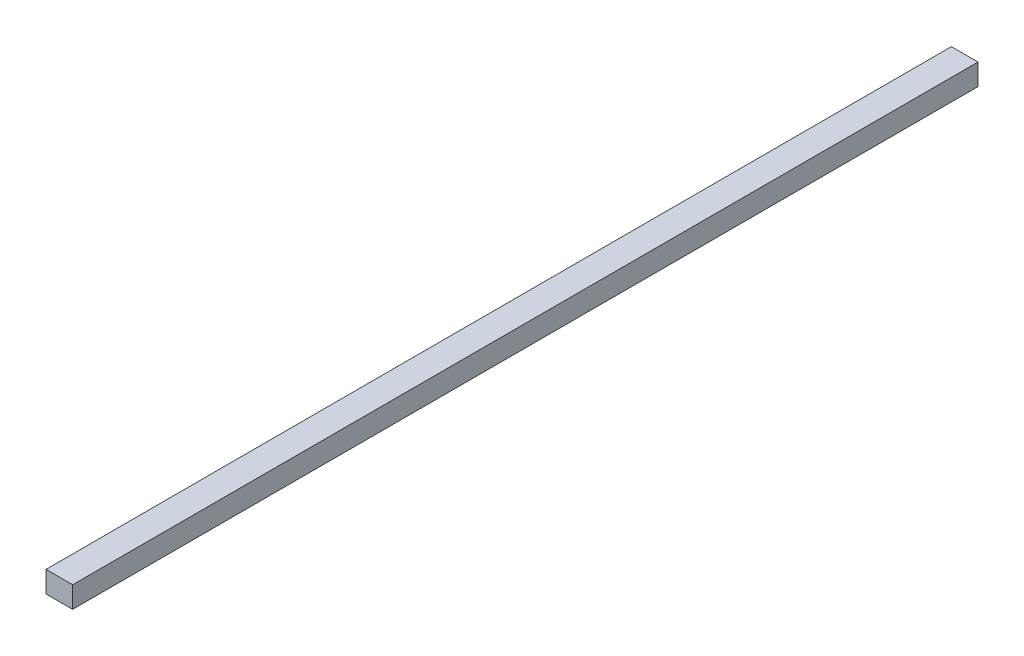
ISO-10303-21;
HEADER;
FILE_DESCRIPTION(('STEP AP214'),'2;1');
FILE_NAME('part.step','',(''),(''),'','','');
FILE_SCHEMA(('AUTOMOTIVE_DESIGN { 1 0 10303 214 1 1 1 1 }'));
ENDSEC;
DATA;
#1=APPLICATION_CONTEXT('core data for automotive mechanical design processes');
#2=APPLICATION_PROTOCOL_DEFINITION('international standard','automotive_design',2000,#1);
#3=PRODUCT_CONTEXT('',#1,'mechanical');
#4=PRODUCT('Part','Part','',(#3));
#5=PRODUCT_RELATED_PRODUCT_CATEGORY('part','',(#4));
#6=PRODUCT_DEFINITION_FORMATION('','',#4);
#7=PRODUCT_DEFINITION_CONTEXT('part definition',#1,'design');
#8=PRODUCT_DEFINITION('design','',#6,#7);
#9=PRODUCT_DEFINITION_SHAPE('','',#8);
#10=(LENGTH_UNIT() NAMED_UNIT(*) SI_UNIT(.MILLI.,.METRE.));
#11=(NAMED_UNIT(*) PLANE_ANGLE_UNIT() SI_UNIT($,.RADIAN.));
#12=(NAMED_UNIT(*) SI_UNIT($,.STERADIAN.) SOLID_ANGLE_UNIT());
#13=UNCERTAINTY_MEASURE_WITH_UNIT(LENGTH_MEASURE(1.E-05),#10,'distance_accuracy_value','');
#14=(GEOMETRIC_REPRESENTATION_CONTEXT(3) GLOBAL_UNCERTAINTY_ASSIGNED_CONTEXT((#13)) GLOBAL_UNIT_ASSIGNED_CONTEXT((#10,
#11,#12)) REPRESENTATION_CONTEXT('',''));
#15=CARTESIAN_POINT('',(0.,0.,0.));
#16=DIRECTION('',(0.,0.,1.));
#17=DIRECTION('',(1.,0.,0.));
#18=AXIS2_PLACEMENT_3D('',#15,#16,#17);
#19=CARTESIAN_POINT('',(-5.,4.,340.));
#20=DIRECTION('',(1.,0.,0.));
#21=DIRECTION('',(0.,1.,0.));
#22=AXIS2_PLACEMENT_3D('',#19,#20,#21);
#23=PLANE('',#22);
#24=DIRECTION('',(0.,-1.,0.));
#25=VECTOR('',#24,1.);
#26=CARTESIAN_POINT('',(-5.,4.,0.));
#27=LINE('',#26,#25);
#28=CARTESIAN_POINT('',(-5.,4.,0.));
#29=VERTEX_POINT('',#28);
#30=CARTESIAN_POINT('',(-5.,-4.,0.));
#31=VERTEX_POINT('',#30);
#32=EDGE_CURVE('E96',#29,#31,#27,.T.);
#33=ORIENTED_EDGE('',*,*,#32,.T.);
#34=DIRECTION('',(0.,0.,-1.));
#35=VECTOR('',#34,1.);
#36=CARTESIAN_POINT('',(-5.,-4.,340.));
#37=LINE('',#36,#35);
#38=CARTESIAN_POINT('',(-5.,-4.,340.));
#39=VERTEX_POINT('',#38);
#40=EDGE_CURVE('E11',#39,#31,#37,.T.);
#41=ORIENTED_EDGE('',*,*,#40,.F.);
#42=DIRECTION('',(0.,-1.,0.));
#43=VECTOR('',#42,1.);
#44=CARTESIAN_POINT('',(-5.,4.,340.));
#45=LINE('',#44,#43);
#46=CARTESIAN_POINT('',(-5.,4.,340.));
#47=VERTEX_POINT('',#46);
#48=EDGE_CURVE('E84',#47,#39,#45,.T.);
#49=ORIENTED_EDGE('',*,*,#48,.F.);
#50=DIRECTION('',(0.,0.,-1.));
#51=VECTOR('',#50,1.);
#52=CARTESIAN_POINT('',(-5.,4.,340.));
#53=LINE('',#52,#51);
#54=EDGE_CURVE('E92',#47,#29,#53,.T.);
#55=ORIENTED_EDGE('',*,*,#54,.T.);
#56=EDGE_LOOP('',(#33,#41,#49,#55));
#57=FACE_BOUND('',#56,.T.);
#58=ADVANCED_FACE('F33',(#57),#23,.F.);
#59=CARTESIAN_POINT('',(-5.,-4.,340.));
#60=DIRECTION('',(0.,1.,0.));
#61=DIRECTION('',(0.,0.,1.));
#62=AXIS2_PLACEMENT_3D('',#59,#60,#61);
#63=PLANE('',#62);
#64=DIRECTION('',(1.,0.,0.));
#65=VECTOR('',#64,1.);
#66=CARTESIAN_POINT('',(-5.,-4.,0.));
#67=LINE('',#66,#65);
#68=CARTESIAN_POINT('',(5.,-4.,0.));
#69=VERTEX_POINT('',#68);
#70=EDGE_CURVE('E88',#31,#69,#67,.T.);
#71=ORIENTED_EDGE('',*,*,#70,.T.);
#72=DIRECTION('',(0.,0.,-1.));
#73=VECTOR('',#72,1.);
#74=CARTESIAN_POINT('',(5.,-4.,340.));
#75=LINE('',#74,#73);
#76=CARTESIAN_POINT('',(5.,-4.,340.));
#77=VERTEX_POINT('',#76);
#78=EDGE_CURVE('E41',#77,#69,#75,.T.);
#79=ORIENTED_EDGE('',*,*,#78,.F.);
#80=DIRECTION('',(1.,0.,0.));
#81=VECTOR('',#80,1.);
#82=CARTESIAN_POINT('',(-5.,-4.,340.));
#83=LINE('',#82,#81);
#84=EDGE_CURVE('E79',#39,#77,#83,.T.);
#85=ORIENTED_EDGE('',*,*,#84,.F.);
#86=ORIENTED_EDGE('',*,*,#40,.T.);
#87=EDGE_LOOP('',(#71,#79,#85,#86));
#88=FACE_BOUND('',#87,.T.);
#89=ADVANCED_FACE('F87',(#88),#63,.F.);
#90=CARTESIAN_POINT('',(5.,4.,340.));
#91=DIRECTION('',(-1.,0.,0.));
#92=DIRECTION('',(0.,0.,1.));
#93=AXIS2_PLACEMENT_3D('',#90,#91,#92);
#94=PLANE('',#93);
#95=DIRECTION('',(0.,1.,0.));
#96=VECTOR('',#95,1.);
#97=CARTESIAN_POINT('',(5.,4.,0.));
#98=LINE('',#97,#96);
#99=CARTESIAN_POINT('',(5.,4.,0.));
#100=VERTEX_POINT('',#99);
#101=EDGE_CURVE('E66',#69,#100,#98,.T.);
#102=ORIENTED_EDGE('',*,*,#101,.T.);
#103=DIRECTION('',(0.,0.,-1.));
#104=VECTOR('',#103,1.);
#105=CARTESIAN_POINT('',(5.,4.,340.));
#106=LINE('',#105,#104);
#107=CARTESIAN_POINT('',(5.,4.,340.));
#108=VERTEX_POINT('',#107);
#109=EDGE_CURVE('E89',#108,#100,#106,.T.);
#110=ORIENTED_EDGE('',*,*,#109,.F.);
#111=DIRECTION('',(0.,1.,0.));
#112=VECTOR('',#111,1.);
#113=CARTESIAN_POINT('',(5.,4.,340.));
#114=LINE('',#113,#112);
#115=EDGE_CURVE('E82',#77,#108,#114,.T.);
#116=ORIENTED_EDGE('',*,*,#115,.F.);
#117=ORIENTED_EDGE('',*,*,#78,.T.);
#118=EDGE_LOOP('',(#102,#110,#116,#117));
#119=FACE_BOUND('',#118,.T.);
#120=ADVANCED_FACE('F90',(#119),#94,.F.);
#121=CARTESIAN_POINT('',(-5.,4.,340.));
#122=DIRECTION('',(0.,-1.,0.));
#123=DIRECTION('',(0.,0.,-1.));
#124=AXIS2_PLACEMENT_3D('',#121,#122,#123);
#125=PLANE('',#124);
#126=DIRECTION('',(-1.,0.,0.));
#127=VECTOR('',#126,1.);
#128=CARTESIAN_POINT('',(-5.,4.,0.));
#129=LINE('',#128,#127);
#130=EDGE_CURVE('E72',#100,#29,#129,.T.);
#131=ORIENTED_EDGE('',*,*,#130,.T.);
#132=ORIENTED_EDGE('',*,*,#54,.F.);
#133=DIRECTION('',(-1.,0.,0.));
#134=VECTOR('',#133,1.);
#135=CARTESIAN_POINT('',(-5.,4.,340.));
#136=LINE('',#135,#134);
#137=EDGE_CURVE('E49',#108,#47,#136,.T.);
#138=ORIENTED_EDGE('',*,*,#137,.F.);
#139=ORIENTED_EDGE('',*,*,#109,.T.);
#140=EDGE_LOOP('',(#131,#132,#138,#139));
#141=FACE_BOUND('',#140,.T.);
#142=ADVANCED_FACE('F103',(#141),#125,.F.);
#143=CARTESIAN_POINT('',(0.,0.,340.));
#144=DIRECTION('',(0.,0.,1.));
#145=DIRECTION('',(1.,0.,0.));
#146=AXIS2_PLACEMENT_3D('',#143,#144,#145);
#147=PLANE('',#146);
#148=ORIENTED_EDGE('',*,*,#48,.T.);
#149=ORIENTED_EDGE('',*,*,#84,.T.);
#150=ORIENTED_EDGE('',*,*,#115,.T.);
#151=ORIENTED_EDGE('',*,*,#137,.T.);
#152=EDGE_LOOP('',(#148,#149,#150,#151));
#153=FACE_BOUND('',#152,.T.);
#154=ADVANCED_FACE('F80',(#153),#147,.T.);
#155=CARTESIAN_POINT('',(0.,0.,0.));
#156=DIRECTION('',(0.,0.,1.));
#157=DIRECTION('',(1.,0.,0.));
#158=AXIS2_PLACEMENT_3D('',#155,#156,#157);
#159=PLANE('',#158);
#160=ORIENTED_EDGE('',*,*,#32,.F.);
#161=ORIENTED_EDGE('',*,*,#130,.F.);
#162=ORIENTED_EDGE('',*,*,#101,.F.);
#163=ORIENTED_EDGE('',*,*,#70,.F.);
#164=EDGE_LOOP('',(#160,#161,#162,#163));
#165=FACE_BOUND('',#164,.T.);
#166=ADVANCED_FACE('F106',(#165),#159,.F.);
#167=CLOSED_SHELL('',(#58,#89,#120,#142,#154,#166));
#168=MANIFOLD_SOLID_BREP('B2',#167);
#169=ADVANCED_BREP_SHAPE_REPRESENTATION('',(#18,#168),#14);
#170=SHAPE_DEFINITION_REPRESENTATION(#9,#169);
ENDSEC;
END-ISO-10303-21;
